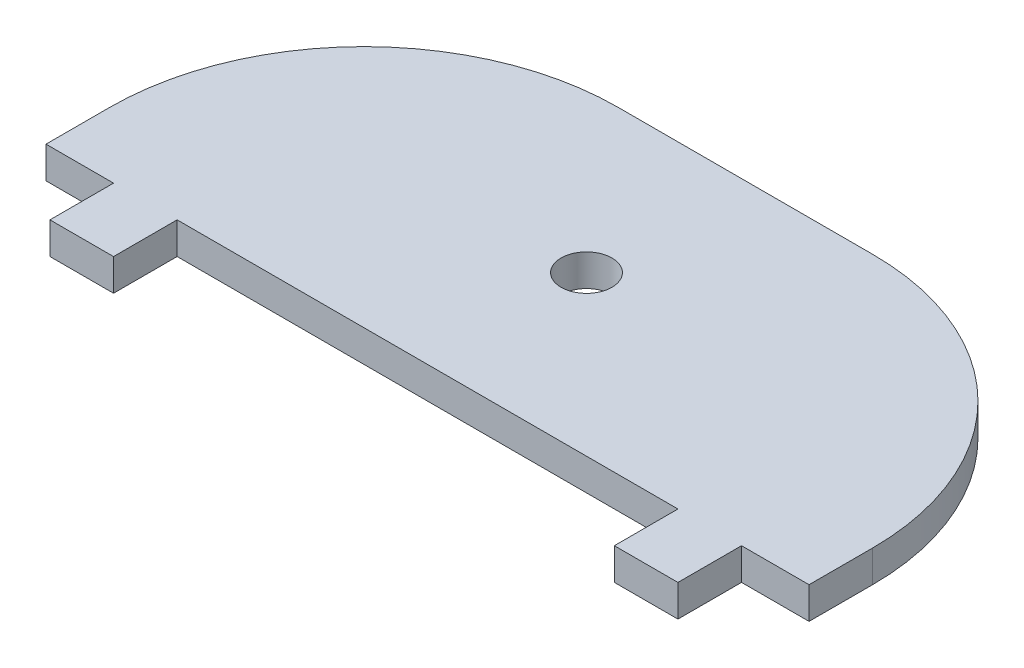
ISO-10303-21;
HEADER;
FILE_DESCRIPTION(('STEP AP214'),'2;1');
FILE_NAME('part.step','',(''),(''),'','','');
FILE_SCHEMA(('AUTOMOTIVE_DESIGN { 1 0 10303 214 1 1 1 1 }'));
ENDSEC;
DATA;
#1=APPLICATION_CONTEXT('core data for automotive mechanical design processes');
#2=APPLICATION_PROTOCOL_DEFINITION('international standard','automotive_design',2000,#1);
#3=PRODUCT_CONTEXT('',#1,'mechanical');
#4=PRODUCT('Part','Part','',(#3));
#5=PRODUCT_RELATED_PRODUCT_CATEGORY('part','',(#4));
#6=PRODUCT_DEFINITION_FORMATION('','',#4);
#7=PRODUCT_DEFINITION_CONTEXT('part definition',#1,'design');
#8=PRODUCT_DEFINITION('design','',#6,#7);
#9=PRODUCT_DEFINITION_SHAPE('','',#8);
#10=(LENGTH_UNIT() NAMED_UNIT(*) SI_UNIT(.MILLI.,.METRE.));
#11=(NAMED_UNIT(*) PLANE_ANGLE_UNIT() SI_UNIT($,.RADIAN.));
#12=(NAMED_UNIT(*) SI_UNIT($,.STERADIAN.) SOLID_ANGLE_UNIT());
#13=UNCERTAINTY_MEASURE_WITH_UNIT(LENGTH_MEASURE(1.E-05),#10,'distance_accuracy_value','');
#14=(GEOMETRIC_REPRESENTATION_CONTEXT(3) GLOBAL_UNCERTAINTY_ASSIGNED_CONTEXT((#13)) GLOBAL_UNIT_ASSIGNED_CONTEXT((#10,
#11,#12)) REPRESENTATION_CONTEXT('',''));
#15=CARTESIAN_POINT('',(0.,0.,0.));
#16=DIRECTION('',(0.,0.,1.));
#17=DIRECTION('',(1.,0.,0.));
#18=AXIS2_PLACEMENT_3D('',#15,#16,#17);
#19=CARTESIAN_POINT('',(0.,1.25,0.));
#20=DIRECTION('',(0.,1.,0.));
#21=DIRECTION('',(0.,0.,1.));
#22=AXIS2_PLACEMENT_3D('',#19,#20,#21);
#23=PLANE('',#22);
#24=DIRECTION('',(0.,0.,-1.));
#25=VECTOR('',#24,1.);
#26=CARTESIAN_POINT('',(30.,1.25,12.5));
#27=LINE('',#26,#25);
#28=CARTESIAN_POINT('',(30.,1.25,12.5));
#29=VERTEX_POINT('',#28);
#30=CARTESIAN_POINT('',(30.,1.25,7.5));
#31=VERTEX_POINT('',#30);
#32=EDGE_CURVE('E179',#29,#31,#27,.T.);
#33=ORIENTED_EDGE('',*,*,#32,.T.);
#34=CARTESIAN_POINT('',(9.99999999999999,1.25,7.5));
#35=DIRECTION('',(0.,1.,0.));
#36=DIRECTION('',(0.,0.,1.));
#37=AXIS2_PLACEMENT_3D('',#34,#35,#36);
#38=CIRCLE('',#37,20.);
#39=CARTESIAN_POINT('',(9.99999999999999,1.25,-12.5));
#40=VERTEX_POINT('',#39);
#41=EDGE_CURVE('E45',#31,#40,#38,.T.);
#42=ORIENTED_EDGE('',*,*,#41,.T.);
#43=DIRECTION('',(-1.,0.,0.));
#44=VECTOR('',#43,1.);
#45=CARTESIAN_POINT('',(30.,1.25,-12.5));
#46=LINE('',#45,#44);
#47=CARTESIAN_POINT('',(-10.,1.25,-12.5));
#48=VERTEX_POINT('',#47);
#49=EDGE_CURVE('E178',#40,#48,#46,.T.);
#50=ORIENTED_EDGE('',*,*,#49,.T.);
#51=CARTESIAN_POINT('',(-10.,1.25,7.5));
#52=DIRECTION('',(0.,1.,0.));
#53=DIRECTION('',(0.,0.,1.));
#54=AXIS2_PLACEMENT_3D('',#51,#52,#53);
#55=CIRCLE('',#54,20.);
#56=CARTESIAN_POINT('',(-30.,1.25,7.5));
#57=VERTEX_POINT('',#56);
#58=EDGE_CURVE('E52',#48,#57,#55,.T.);
#59=ORIENTED_EDGE('',*,*,#58,.T.);
#60=DIRECTION('',(0.,0.,1.));
#61=VECTOR('',#60,1.);
#62=CARTESIAN_POINT('',(-30.,1.25,12.5));
#63=LINE('',#62,#61);
#64=CARTESIAN_POINT('',(-30.,1.25,12.5));
#65=VERTEX_POINT('',#64);
#66=EDGE_CURVE('E138',#57,#65,#63,.T.);
#67=ORIENTED_EDGE('',*,*,#66,.T.);
#68=DIRECTION('',(1.,0.,0.));
#69=VECTOR('',#68,1.);
#70=CARTESIAN_POINT('',(-30.,1.25,12.5));
#71=LINE('',#70,#69);
#72=CARTESIAN_POINT('',(-24.69,1.25,12.5));
#73=VERTEX_POINT('',#72);
#74=EDGE_CURVE('E141',#65,#73,#71,.T.);
#75=ORIENTED_EDGE('',*,*,#74,.T.);
#76=DIRECTION('',(0.,0.,1.));
#77=VECTOR('',#76,1.);
#78=CARTESIAN_POINT('',(-24.69,1.25,12.5));
#79=LINE('',#78,#77);
#80=CARTESIAN_POINT('',(-24.69,1.25,17.5));
#81=VERTEX_POINT('',#80);
#82=EDGE_CURVE('E155',#73,#81,#79,.T.);
#83=ORIENTED_EDGE('',*,*,#82,.T.);
#84=DIRECTION('',(1.,0.,0.));
#85=VECTOR('',#84,1.);
#86=CARTESIAN_POINT('',(-24.69,1.25,17.5));
#87=LINE('',#86,#85);
#88=CARTESIAN_POINT('',(-19.69,1.25,17.5));
#89=VERTEX_POINT('',#88);
#90=EDGE_CURVE('E232',#81,#89,#87,.T.);
#91=ORIENTED_EDGE('',*,*,#90,.T.);
#92=DIRECTION('',(0.,0.,-1.));
#93=VECTOR('',#92,1.);
#94=CARTESIAN_POINT('',(-19.69,1.25,12.5));
#95=LINE('',#94,#93);
#96=CARTESIAN_POINT('',(-19.69,1.25,12.5));
#97=VERTEX_POINT('',#96);
#98=EDGE_CURVE('E271',#89,#97,#95,.T.);
#99=ORIENTED_EDGE('',*,*,#98,.T.);
#100=DIRECTION('',(1.,0.,0.));
#101=VECTOR('',#100,1.);
#102=CARTESIAN_POINT('',(-19.69,1.25,12.5));
#103=LINE('',#102,#101);
#104=CARTESIAN_POINT('',(19.69,1.25,12.5));
#105=VERTEX_POINT('',#104);
#106=EDGE_CURVE('E275',#97,#105,#103,.T.);
#107=ORIENTED_EDGE('',*,*,#106,.T.);
#108=DIRECTION('',(0.,0.,1.));
#109=VECTOR('',#108,1.);
#110=CARTESIAN_POINT('',(19.69,1.25,12.5));
#111=LINE('',#110,#109);
#112=CARTESIAN_POINT('',(19.69,1.25,17.5));
#113=VERTEX_POINT('',#112);
#114=EDGE_CURVE('E277',#105,#113,#111,.T.);
#115=ORIENTED_EDGE('',*,*,#114,.T.);
#116=DIRECTION('',(1.,0.,0.));
#117=VECTOR('',#116,1.);
#118=CARTESIAN_POINT('',(24.69,1.25,17.5));
#119=LINE('',#118,#117);
#120=CARTESIAN_POINT('',(24.69,1.25,17.5));
#121=VERTEX_POINT('',#120);
#122=EDGE_CURVE('E264',#113,#121,#119,.T.);
#123=ORIENTED_EDGE('',*,*,#122,.T.);
#124=DIRECTION('',(0.,0.,-1.));
#125=VECTOR('',#124,1.);
#126=CARTESIAN_POINT('',(24.69,1.25,12.5));
#127=LINE('',#126,#125);
#128=CARTESIAN_POINT('',(24.69,1.25,12.5));
#129=VERTEX_POINT('',#128);
#130=EDGE_CURVE('E261',#121,#129,#127,.T.);
#131=ORIENTED_EDGE('',*,*,#130,.T.);
#132=DIRECTION('',(1.,0.,0.));
#133=VECTOR('',#132,1.);
#134=CARTESIAN_POINT('',(24.69,1.25,12.5));
#135=LINE('',#134,#133);
#136=EDGE_CURVE('E260',#129,#29,#135,.T.);
#137=ORIENTED_EDGE('',*,*,#136,.T.);
#138=EDGE_LOOP('',(#33,#42,#50,#59,#67,#75,#83,#91,#99,#107,#115,#123,#131,#137));
#139=FACE_BOUND('',#138,.T.);
#140=CARTESIAN_POINT('',(0.,1.25,0.));
#141=DIRECTION('',(0.,1.,0.));
#142=DIRECTION('',(0.,0.,1.));
#143=AXIS2_PLACEMENT_3D('',#140,#141,#142);
#144=CIRCLE('',#143,2.);
#145=CARTESIAN_POINT('',(0.,1.25,2.00000000000001));
#146=VERTEX_POINT('',#145);
#147=EDGE_CURVE('E268',#146,#146,#144,.T.);
#148=ORIENTED_EDGE('',*,*,#147,.F.);
#149=EDGE_LOOP('',(#148));
#150=FACE_BOUND('',#149,.T.);
#151=ADVANCED_FACE('F37',(#139,#150),#23,.T.);
#152=CARTESIAN_POINT('',(0.,-1.25,0.));
#153=DIRECTION('',(0.,1.,0.));
#154=DIRECTION('',(0.,0.,1.));
#155=AXIS2_PLACEMENT_3D('',#152,#153,#154);
#156=PLANE('',#155);
#157=DIRECTION('',(-1.,0.,0.));
#158=VECTOR('',#157,1.);
#159=CARTESIAN_POINT('',(30.,-1.25,-12.5));
#160=LINE('',#159,#158);
#161=CARTESIAN_POINT('',(9.99999999999999,-1.25,-12.5));
#162=VERTEX_POINT('',#161);
#163=CARTESIAN_POINT('',(-10.,-1.25,-12.5));
#164=VERTEX_POINT('',#163);
#165=EDGE_CURVE('E146',#162,#164,#160,.T.);
#166=ORIENTED_EDGE('',*,*,#165,.F.);
#167=CARTESIAN_POINT('',(9.99999999999999,-1.25,7.5));
#168=DIRECTION('',(0.,1.,0.));
#169=DIRECTION('',(0.,0.,1.));
#170=AXIS2_PLACEMENT_3D('',#167,#168,#169);
#171=CIRCLE('',#170,20.);
#172=CARTESIAN_POINT('',(30.,-1.25,7.5));
#173=VERTEX_POINT('',#172);
#174=EDGE_CURVE('E173',#162,#173,#171,.F.);
#175=ORIENTED_EDGE('',*,*,#174,.T.);
#176=DIRECTION('',(0.,0.,-1.));
#177=VECTOR('',#176,1.);
#178=CARTESIAN_POINT('',(30.,-1.25,12.5));
#179=LINE('',#178,#177);
#180=CARTESIAN_POINT('',(30.,-1.25,12.5));
#181=VERTEX_POINT('',#180);
#182=EDGE_CURVE('E195',#181,#173,#179,.T.);
#183=ORIENTED_EDGE('',*,*,#182,.F.);
#184=DIRECTION('',(1.,0.,0.));
#185=VECTOR('',#184,1.);
#186=CARTESIAN_POINT('',(24.69,-1.25,12.5));
#187=LINE('',#186,#185);
#188=CARTESIAN_POINT('',(24.69,-1.25,12.5));
#189=VERTEX_POINT('',#188);
#190=EDGE_CURVE('E199',#189,#181,#187,.T.);
#191=ORIENTED_EDGE('',*,*,#190,.F.);
#192=DIRECTION('',(0.,0.,-1.));
#193=VECTOR('',#192,1.);
#194=CARTESIAN_POINT('',(24.69,-1.25,12.5));
#195=LINE('',#194,#193);
#196=CARTESIAN_POINT('',(24.69,-1.25,17.5));
#197=VERTEX_POINT('',#196);
#198=EDGE_CURVE('E202',#197,#189,#195,.T.);
#199=ORIENTED_EDGE('',*,*,#198,.F.);
#200=DIRECTION('',(1.,0.,0.));
#201=VECTOR('',#200,1.);
#202=CARTESIAN_POINT('',(24.69,-1.25,17.5));
#203=LINE('',#202,#201);
#204=CARTESIAN_POINT('',(19.69,-1.25,17.5));
#205=VERTEX_POINT('',#204);
#206=EDGE_CURVE('E249',#205,#197,#203,.T.);
#207=ORIENTED_EDGE('',*,*,#206,.F.);
#208=DIRECTION('',(0.,0.,1.));
#209=VECTOR('',#208,1.);
#210=CARTESIAN_POINT('',(19.69,-1.25,12.5));
#211=LINE('',#210,#209);
#212=CARTESIAN_POINT('',(19.69,-1.25,12.5));
#213=VERTEX_POINT('',#212);
#214=EDGE_CURVE('E247',#213,#205,#211,.T.);
#215=ORIENTED_EDGE('',*,*,#214,.F.);
#216=DIRECTION('',(1.,0.,0.));
#217=VECTOR('',#216,1.);
#218=CARTESIAN_POINT('',(-19.69,-1.25,12.5));
#219=LINE('',#218,#217);
#220=CARTESIAN_POINT('',(-19.69,-1.25,12.5));
#221=VERTEX_POINT('',#220);
#222=EDGE_CURVE('E240',#221,#213,#219,.T.);
#223=ORIENTED_EDGE('',*,*,#222,.F.);
#224=DIRECTION('',(0.,0.,-1.));
#225=VECTOR('',#224,1.);
#226=CARTESIAN_POINT('',(-19.69,-1.25,12.5));
#227=LINE('',#226,#225);
#228=CARTESIAN_POINT('',(-19.69,-1.25,17.5));
#229=VERTEX_POINT('',#228);
#230=EDGE_CURVE('E238',#229,#221,#227,.T.);
#231=ORIENTED_EDGE('',*,*,#230,.F.);
#232=DIRECTION('',(1.,0.,0.));
#233=VECTOR('',#232,1.);
#234=CARTESIAN_POINT('',(-24.69,-1.25,17.5));
#235=LINE('',#234,#233);
#236=CARTESIAN_POINT('',(-24.69,-1.25,17.5));
#237=VERTEX_POINT('',#236);
#238=EDGE_CURVE('E231',#237,#229,#235,.T.);
#239=ORIENTED_EDGE('',*,*,#238,.F.);
#240=DIRECTION('',(0.,0.,1.));
#241=VECTOR('',#240,1.);
#242=CARTESIAN_POINT('',(-24.69,-1.25,12.5));
#243=LINE('',#242,#241);
#244=CARTESIAN_POINT('',(-24.69,-1.25,12.5));
#245=VERTEX_POINT('',#244);
#246=EDGE_CURVE('E236',#245,#237,#243,.T.);
#247=ORIENTED_EDGE('',*,*,#246,.F.);
#248=DIRECTION('',(1.,0.,0.));
#249=VECTOR('',#248,1.);
#250=CARTESIAN_POINT('',(-30.,-1.25,12.5));
#251=LINE('',#250,#249);
#252=CARTESIAN_POINT('',(-30.,-1.25,12.5));
#253=VERTEX_POINT('',#252);
#254=EDGE_CURVE('E242',#253,#245,#251,.T.);
#255=ORIENTED_EDGE('',*,*,#254,.F.);
#256=DIRECTION('',(0.,0.,1.));
#257=VECTOR('',#256,1.);
#258=CARTESIAN_POINT('',(-30.,-1.25,12.5));
#259=LINE('',#258,#257);
#260=CARTESIAN_POINT('',(-30.,-1.25,7.5));
#261=VERTEX_POINT('',#260);
#262=EDGE_CURVE('E159',#261,#253,#259,.T.);
#263=ORIENTED_EDGE('',*,*,#262,.F.);
#264=CARTESIAN_POINT('',(-10.,-1.25,7.5));
#265=DIRECTION('',(0.,1.,0.));
#266=DIRECTION('',(0.,0.,1.));
#267=AXIS2_PLACEMENT_3D('',#264,#265,#266);
#268=CIRCLE('',#267,20.);
#269=EDGE_CURVE('E171',#261,#164,#268,.F.);
#270=ORIENTED_EDGE('',*,*,#269,.T.);
#271=EDGE_LOOP('',(#166,#175,#183,#191,#199,#207,#215,#223,#231,#239,#247,#255,#263,#270));
#272=FACE_BOUND('',#271,.T.);
#273=CARTESIAN_POINT('',(0.,-1.25,0.));
#274=DIRECTION('',(0.,1.,0.));
#275=DIRECTION('',(0.,0.,1.));
#276=AXIS2_PLACEMENT_3D('',#273,#274,#275);
#277=CIRCLE('',#276,2.);
#278=CARTESIAN_POINT('',(0.,-1.25,2.00000000000001));
#279=VERTEX_POINT('',#278);
#280=EDGE_CURVE('E436',#279,#279,#277,.T.);
#281=ORIENTED_EDGE('',*,*,#280,.T.);
#282=EDGE_LOOP('',(#281));
#283=FACE_BOUND('',#282,.T.);
#284=ADVANCED_FACE('F192',(#272,#283),#156,.F.);
#285=CARTESIAN_POINT('',(-30.,1.25,12.5));
#286=DIRECTION('',(1.,0.,0.));
#287=DIRECTION('',(0.,0.,-1.));
#288=AXIS2_PLACEMENT_3D('',#285,#286,#287);
#289=PLANE('',#288);
#290=ORIENTED_EDGE('',*,*,#66,.F.);
#291=DIRECTION('',(0.,-1.,0.));
#292=VECTOR('',#291,1.);
#293=CARTESIAN_POINT('',(-30.,1.25,7.5));
#294=LINE('',#293,#292);
#295=EDGE_CURVE('E11',#57,#261,#294,.T.);
#296=ORIENTED_EDGE('',*,*,#295,.T.);
#297=ORIENTED_EDGE('',*,*,#262,.T.);
#298=DIRECTION('',(0.,-1.,0.));
#299=VECTOR('',#298,1.);
#300=CARTESIAN_POINT('',(-30.,1.25,12.5));
#301=LINE('',#300,#299);
#302=EDGE_CURVE('E151',#65,#253,#301,.T.);
#303=ORIENTED_EDGE('',*,*,#302,.F.);
#304=EDGE_LOOP('',(#290,#296,#297,#303));
#305=FACE_BOUND('',#304,.T.);
#306=ADVANCED_FACE('F157',(#305),#289,.F.);
#307=CARTESIAN_POINT('',(-30.,1.25,12.5));
#308=DIRECTION('',(0.,0.,-1.));
#309=DIRECTION('',(-1.,0.,0.));
#310=AXIS2_PLACEMENT_3D('',#307,#308,#309);
#311=PLANE('',#310);
#312=ORIENTED_EDGE('',*,*,#254,.T.);
#313=DIRECTION('',(0.,-1.,0.));
#314=VECTOR('',#313,1.);
#315=CARTESIAN_POINT('',(-24.69,1.25,12.5));
#316=LINE('',#315,#314);
#317=EDGE_CURVE('E153',#73,#245,#316,.T.);
#318=ORIENTED_EDGE('',*,*,#317,.F.);
#319=ORIENTED_EDGE('',*,*,#74,.F.);
#320=ORIENTED_EDGE('',*,*,#302,.T.);
#321=EDGE_LOOP('',(#312,#318,#319,#320));
#322=FACE_BOUND('',#321,.T.);
#323=ADVANCED_FACE('F150',(#322),#311,.F.);
#324=CARTESIAN_POINT('',(-24.69,1.25,12.5));
#325=DIRECTION('',(1.,0.,0.));
#326=DIRECTION('',(0.,0.,-1.));
#327=AXIS2_PLACEMENT_3D('',#324,#325,#326);
#328=PLANE('',#327);
#329=ORIENTED_EDGE('',*,*,#246,.T.);
#330=DIRECTION('',(0.,-1.,0.));
#331=VECTOR('',#330,1.);
#332=CARTESIAN_POINT('',(-24.69,1.25,17.5));
#333=LINE('',#332,#331);
#334=EDGE_CURVE('E165',#81,#237,#333,.T.);
#335=ORIENTED_EDGE('',*,*,#334,.F.);
#336=ORIENTED_EDGE('',*,*,#82,.F.);
#337=ORIENTED_EDGE('',*,*,#317,.T.);
#338=EDGE_LOOP('',(#329,#335,#336,#337));
#339=FACE_BOUND('',#338,.T.);
#340=ADVANCED_FACE('F269',(#339),#328,.F.);
#341=CARTESIAN_POINT('',(-24.69,1.25,17.5));
#342=DIRECTION('',(0.,0.,-1.));
#343=DIRECTION('',(-1.,0.,0.));
#344=AXIS2_PLACEMENT_3D('',#341,#342,#343);
#345=PLANE('',#344);
#346=ORIENTED_EDGE('',*,*,#238,.T.);
#347=DIRECTION('',(0.,-1.,0.));
#348=VECTOR('',#347,1.);
#349=CARTESIAN_POINT('',(-19.69,1.25,17.5));
#350=LINE('',#349,#348);
#351=EDGE_CURVE('E222',#89,#229,#350,.T.);
#352=ORIENTED_EDGE('',*,*,#351,.F.);
#353=ORIENTED_EDGE('',*,*,#90,.F.);
#354=ORIENTED_EDGE('',*,*,#334,.T.);
#355=EDGE_LOOP('',(#346,#352,#353,#354));
#356=FACE_BOUND('',#355,.T.);
#357=ADVANCED_FACE('F229',(#356),#345,.F.);
#358=CARTESIAN_POINT('',(-19.69,1.25,12.5));
#359=DIRECTION('',(-1.,0.,0.));
#360=DIRECTION('',(0.,0.,1.));
#361=AXIS2_PLACEMENT_3D('',#358,#359,#360);
#362=PLANE('',#361);
#363=ORIENTED_EDGE('',*,*,#230,.T.);
#364=DIRECTION('',(0.,-1.,0.));
#365=VECTOR('',#364,1.);
#366=CARTESIAN_POINT('',(-19.69,1.25,12.5));
#367=LINE('',#366,#365);
#368=EDGE_CURVE('E219',#97,#221,#367,.T.);
#369=ORIENTED_EDGE('',*,*,#368,.F.);
#370=ORIENTED_EDGE('',*,*,#98,.F.);
#371=ORIENTED_EDGE('',*,*,#351,.T.);
#372=EDGE_LOOP('',(#363,#369,#370,#371));
#373=FACE_BOUND('',#372,.T.);
#374=ADVANCED_FACE('F293',(#373),#362,.F.);
#375=CARTESIAN_POINT('',(-19.69,1.25,12.5));
#376=DIRECTION('',(0.,0.,-1.));
#377=DIRECTION('',(-1.,0.,0.));
#378=AXIS2_PLACEMENT_3D('',#375,#376,#377);
#379=PLANE('',#378);
#380=ORIENTED_EDGE('',*,*,#222,.T.);
#381=DIRECTION('',(0.,-1.,0.));
#382=VECTOR('',#381,1.);
#383=CARTESIAN_POINT('',(19.69,1.25,12.5));
#384=LINE('',#383,#382);
#385=EDGE_CURVE('E216',#105,#213,#384,.T.);
#386=ORIENTED_EDGE('',*,*,#385,.F.);
#387=ORIENTED_EDGE('',*,*,#106,.F.);
#388=ORIENTED_EDGE('',*,*,#368,.T.);
#389=EDGE_LOOP('',(#380,#386,#387,#388));
#390=FACE_BOUND('',#389,.T.);
#391=ADVANCED_FACE('F289',(#390),#379,.F.);
#392=CARTESIAN_POINT('',(19.69,1.25,12.5));
#393=DIRECTION('',(1.,0.,0.));
#394=DIRECTION('',(0.,0.,-1.));
#395=AXIS2_PLACEMENT_3D('',#392,#393,#394);
#396=PLANE('',#395);
#397=ORIENTED_EDGE('',*,*,#214,.T.);
#398=DIRECTION('',(0.,-1.,0.));
#399=VECTOR('',#398,1.);
#400=CARTESIAN_POINT('',(19.69,1.25,17.5));
#401=LINE('',#400,#399);
#402=EDGE_CURVE('E213',#113,#205,#401,.T.);
#403=ORIENTED_EDGE('',*,*,#402,.F.);
#404=ORIENTED_EDGE('',*,*,#114,.F.);
#405=ORIENTED_EDGE('',*,*,#385,.T.);
#406=EDGE_LOOP('',(#397,#403,#404,#405));
#407=FACE_BOUND('',#406,.T.);
#408=ADVANCED_FACE('F285',(#407),#396,.F.);
#409=CARTESIAN_POINT('',(24.69,1.25,17.5));
#410=DIRECTION('',(0.,0.,-1.));
#411=DIRECTION('',(-1.,0.,0.));
#412=AXIS2_PLACEMENT_3D('',#409,#410,#411);
#413=PLANE('',#412);
#414=ORIENTED_EDGE('',*,*,#206,.T.);
#415=DIRECTION('',(0.,-1.,0.));
#416=VECTOR('',#415,1.);
#417=CARTESIAN_POINT('',(24.69,1.25,17.5));
#418=LINE('',#417,#416);
#419=EDGE_CURVE('E210',#121,#197,#418,.T.);
#420=ORIENTED_EDGE('',*,*,#419,.F.);
#421=ORIENTED_EDGE('',*,*,#122,.F.);
#422=ORIENTED_EDGE('',*,*,#402,.T.);
#423=EDGE_LOOP('',(#414,#420,#421,#422));
#424=FACE_BOUND('',#423,.T.);
#425=ADVANCED_FACE('F282',(#424),#413,.F.);
#426=CARTESIAN_POINT('',(24.69,1.25,12.5));
#427=DIRECTION('',(-1.,0.,0.));
#428=DIRECTION('',(0.,0.,1.));
#429=AXIS2_PLACEMENT_3D('',#426,#427,#428);
#430=PLANE('',#429);
#431=ORIENTED_EDGE('',*,*,#198,.T.);
#432=DIRECTION('',(0.,-1.,0.));
#433=VECTOR('',#432,1.);
#434=CARTESIAN_POINT('',(24.69,1.25,12.5));
#435=LINE('',#434,#433);
#436=EDGE_CURVE('E207',#129,#189,#435,.T.);
#437=ORIENTED_EDGE('',*,*,#436,.F.);
#438=ORIENTED_EDGE('',*,*,#130,.F.);
#439=ORIENTED_EDGE('',*,*,#419,.T.);
#440=EDGE_LOOP('',(#431,#437,#438,#439));
#441=FACE_BOUND('',#440,.T.);
#442=ADVANCED_FACE('F253',(#441),#430,.F.);
#443=CARTESIAN_POINT('',(24.69,1.25,12.5));
#444=DIRECTION('',(0.,0.,-1.));
#445=DIRECTION('',(-1.,0.,0.));
#446=AXIS2_PLACEMENT_3D('',#443,#444,#445);
#447=PLANE('',#446);
#448=ORIENTED_EDGE('',*,*,#190,.T.);
#449=DIRECTION('',(0.,-1.,0.));
#450=VECTOR('',#449,1.);
#451=CARTESIAN_POINT('',(30.,1.25,12.5));
#452=LINE('',#451,#450);
#453=EDGE_CURVE('E187',#29,#181,#452,.T.);
#454=ORIENTED_EDGE('',*,*,#453,.F.);
#455=ORIENTED_EDGE('',*,*,#136,.F.);
#456=ORIENTED_EDGE('',*,*,#436,.T.);
#457=EDGE_LOOP('',(#448,#454,#455,#456));
#458=FACE_BOUND('',#457,.T.);
#459=ADVANCED_FACE('F259',(#458),#447,.F.);
#460=CARTESIAN_POINT('',(30.,1.25,12.5));
#461=DIRECTION('',(-1.,0.,0.));
#462=DIRECTION('',(0.,0.,1.));
#463=AXIS2_PLACEMENT_3D('',#460,#461,#462);
#464=PLANE('',#463);
#465=ORIENTED_EDGE('',*,*,#182,.T.);
#466=DIRECTION('',(0.,-1.,0.));
#467=VECTOR('',#466,1.);
#468=CARTESIAN_POINT('',(30.,1.25,7.5));
#469=LINE('',#468,#467);
#470=EDGE_CURVE('E60',#173,#31,#469,.F.);
#471=ORIENTED_EDGE('',*,*,#470,.T.);
#472=ORIENTED_EDGE('',*,*,#32,.F.);
#473=ORIENTED_EDGE('',*,*,#453,.T.);
#474=EDGE_LOOP('',(#465,#471,#472,#473));
#475=FACE_BOUND('',#474,.T.);
#476=ADVANCED_FACE('F197',(#475),#464,.F.);
#477=CARTESIAN_POINT('',(30.,1.25,-12.5));
#478=DIRECTION('',(0.,0.,1.));
#479=DIRECTION('',(1.,0.,0.));
#480=AXIS2_PLACEMENT_3D('',#477,#478,#479);
#481=PLANE('',#480);
#482=ORIENTED_EDGE('',*,*,#49,.F.);
#483=DIRECTION('',(0.,-1.,0.));
#484=VECTOR('',#483,1.);
#485=CARTESIAN_POINT('',(9.99999999999999,1.25,-12.5));
#486=LINE('',#485,#484);
#487=EDGE_CURVE('E163',#40,#162,#486,.T.);
#488=ORIENTED_EDGE('',*,*,#487,.T.);
#489=ORIENTED_EDGE('',*,*,#165,.T.);
#490=DIRECTION('',(0.,-1.,0.));
#491=VECTOR('',#490,1.);
#492=CARTESIAN_POINT('',(-10.,1.25,-12.5));
#493=LINE('',#492,#491);
#494=EDGE_CURVE('E161',#164,#48,#493,.F.);
#495=ORIENTED_EDGE('',*,*,#494,.T.);
#496=EDGE_LOOP('',(#482,#488,#489,#495));
#497=FACE_BOUND('',#496,.T.);
#498=ADVANCED_FACE('F183',(#497),#481,.F.);
#499=CARTESIAN_POINT('',(0.,1.25,0.));
#500=DIRECTION('',(0.,-1.,0.));
#501=DIRECTION('',(0.,0.,-1.));
#502=AXIS2_PLACEMENT_3D('',#499,#500,#501);
#503=CYLINDRICAL_SURFACE('',#502,2.);
#504=ORIENTED_EDGE('',*,*,#147,.T.);
#505=EDGE_LOOP('',(#504));
#506=FACE_BOUND('',#505,.T.);
#507=ORIENTED_EDGE('',*,*,#280,.F.);
#508=EDGE_LOOP('',(#507));
#509=FACE_BOUND('',#508,.T.);
#510=ADVANCED_FACE('F309',(#506,#509),#503,.F.);
#511=CARTESIAN_POINT('',(9.99999999999999,1.25,7.5));
#512=DIRECTION('',(0.,-1.,0.));
#513=DIRECTION('',(0.,0.,-1.));
#514=AXIS2_PLACEMENT_3D('',#511,#512,#513);
#515=CYLINDRICAL_SURFACE('',#514,20.);
#516=ORIENTED_EDGE('',*,*,#41,.F.);
#517=ORIENTED_EDGE('',*,*,#470,.F.);
#518=ORIENTED_EDGE('',*,*,#174,.F.);
#519=ORIENTED_EDGE('',*,*,#487,.F.);
#520=EDGE_LOOP('',(#516,#517,#518,#519));
#521=FACE_BOUND('',#520,.T.);
#522=ADVANCED_FACE('F189',(#521),#515,.T.);
#523=CARTESIAN_POINT('',(-10.,1.25,7.5));
#524=DIRECTION('',(0.,-1.,0.));
#525=DIRECTION('',(0.,0.,-1.));
#526=AXIS2_PLACEMENT_3D('',#523,#524,#525);
#527=CYLINDRICAL_SURFACE('',#526,20.);
#528=ORIENTED_EDGE('',*,*,#58,.F.);
#529=ORIENTED_EDGE('',*,*,#494,.F.);
#530=ORIENTED_EDGE('',*,*,#269,.F.);
#531=ORIENTED_EDGE('',*,*,#295,.F.);
#532=EDGE_LOOP('',(#528,#529,#530,#531));
#533=FACE_BOUND('',#532,.T.);
#534=ADVANCED_FACE('F39',(#533),#527,.T.);
#535=CLOSED_SHELL('',(#151,#284,#306,#323,#340,#357,#374,#391,#408,#425,#442,#459,#476,#498,
#510,#522,#534));
#536=MANIFOLD_SOLID_BREP('B2',#535);
#537=ADVANCED_BREP_SHAPE_REPRESENTATION('',(#18,#536),#14);
#538=SHAPE_DEFINITION_REPRESENTATION(#9,#537);
ENDSEC;
END-ISO-10303-21;
